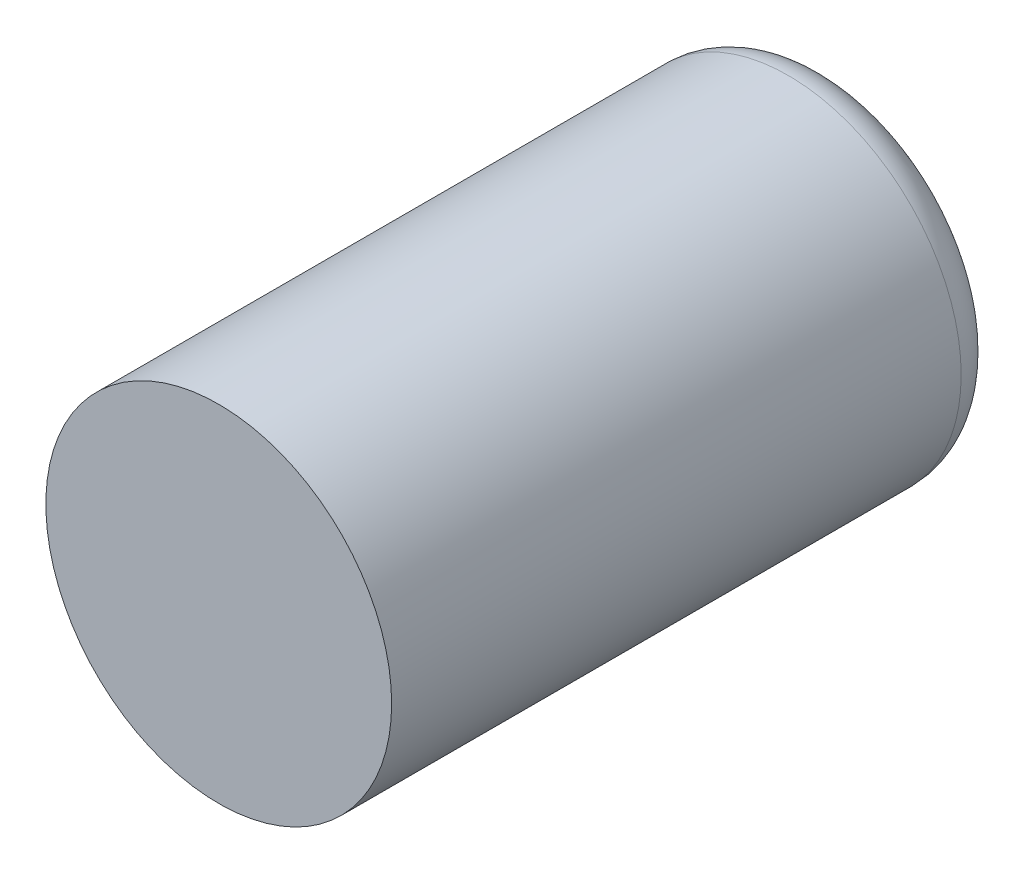
ISO-10303-21;
HEADER;
FILE_DESCRIPTION(('STEP AP214'),'2;1');
FILE_NAME('part.step','',(''),(''),'','','');
FILE_SCHEMA(('AUTOMOTIVE_DESIGN { 1 0 10303 214 1 1 1 1 }'));
ENDSEC;
DATA;
#1=APPLICATION_CONTEXT('core data for automotive mechanical design processes');
#2=APPLICATION_PROTOCOL_DEFINITION('international standard','automotive_design',2000,#1);
#3=PRODUCT_CONTEXT('',#1,'mechanical');
#4=PRODUCT('Part','Part','',(#3));
#5=PRODUCT_RELATED_PRODUCT_CATEGORY('part','',(#4));
#6=PRODUCT_DEFINITION_FORMATION('','',#4);
#7=PRODUCT_DEFINITION_CONTEXT('part definition',#1,'design');
#8=PRODUCT_DEFINITION('design','',#6,#7);
#9=PRODUCT_DEFINITION_SHAPE('','',#8);
#10=(LENGTH_UNIT() NAMED_UNIT(*) SI_UNIT(.MILLI.,.METRE.));
#11=(NAMED_UNIT(*) PLANE_ANGLE_UNIT() SI_UNIT($,.RADIAN.));
#12=(NAMED_UNIT(*) SI_UNIT($,.STERADIAN.) SOLID_ANGLE_UNIT());
#13=UNCERTAINTY_MEASURE_WITH_UNIT(LENGTH_MEASURE(1.E-05),#10,'distance_accuracy_value','');
#14=(GEOMETRIC_REPRESENTATION_CONTEXT(3) GLOBAL_UNCERTAINTY_ASSIGNED_CONTEXT((#13)) GLOBAL_UNIT_ASSIGNED_CONTEXT((#10,
#11,#12)) REPRESENTATION_CONTEXT('',''));
#15=CARTESIAN_POINT('',(0.,0.,0.));
#16=DIRECTION('',(0.,0.,1.));
#17=DIRECTION('',(1.,0.,0.));
#18=AXIS2_PLACEMENT_3D('',#15,#16,#17);
#19=CARTESIAN_POINT('',(0.,0.,2.));
#20=DIRECTION('',(0.,0.,1.));
#21=DIRECTION('',(1.,0.,0.));
#22=AXIS2_PLACEMENT_3D('',#19,#20,#21);
#23=TOROIDAL_SURFACE('',#22,6.5,2.);
#24=CARTESIAN_POINT('',(0.,0.,0.));
#25=DIRECTION('',(0.,0.,1.));
#26=DIRECTION('',(1.,0.,0.));
#27=AXIS2_PLACEMENT_3D('',#24,#25,#26);
#28=CIRCLE('',#27,6.5);
#29=CARTESIAN_POINT('',(6.5,0.,0.));
#30=VERTEX_POINT('',#29);
#31=EDGE_CURVE('E10',#30,#30,#28,.T.);
#32=ORIENTED_EDGE('',*,*,#31,.T.);
#33=EDGE_LOOP('',(#32));
#34=FACE_BOUND('',#33,.T.);
#35=CARTESIAN_POINT('',(0.,0.,2.));
#36=DIRECTION('',(0.,0.,1.));
#37=DIRECTION('',(1.,0.,0.));
#38=AXIS2_PLACEMENT_3D('',#35,#36,#37);
#39=CIRCLE('',#38,8.5);
#40=CARTESIAN_POINT('',(8.5,0.,2.));
#41=VERTEX_POINT('',#40);
#42=EDGE_CURVE('E43',#41,#41,#39,.T.);
#43=ORIENTED_EDGE('',*,*,#42,.F.);
#44=EDGE_LOOP('',(#43));
#45=FACE_BOUND('',#44,.T.);
#46=ADVANCED_FACE('F33',(#34,#45),#23,.T.);
#47=CARTESIAN_POINT('',(6.5,0.,0.));
#48=DIRECTION('',(0.,0.,-1.));
#49=DIRECTION('',(-1.,0.,0.));
#50=AXIS2_PLACEMENT_3D('',#47,#48,#49);
#51=PLANE('',#50);
#52=ORIENTED_EDGE('',*,*,#31,.F.);
#53=EDGE_LOOP('',(#52));
#54=FACE_BOUND('',#53,.T.);
#55=ADVANCED_FACE('F54',(#54),#51,.T.);
#56=CARTESIAN_POINT('',(0.,0.,30.));
#57=DIRECTION('',(0.,0.,1.));
#58=DIRECTION('',(1.,0.,0.));
#59=AXIS2_PLACEMENT_3D('',#56,#57,#58);
#60=PLANE('',#59);
#61=CARTESIAN_POINT('',(0.,0.,30.));
#62=DIRECTION('',(0.,0.,1.));
#63=DIRECTION('',(1.,0.,0.));
#64=AXIS2_PLACEMENT_3D('',#61,#62,#63);
#65=CIRCLE('',#64,8.5);
#66=CARTESIAN_POINT('',(8.5,0.,30.));
#67=VERTEX_POINT('',#66);
#68=EDGE_CURVE('E39',#67,#67,#65,.T.);
#69=ORIENTED_EDGE('',*,*,#68,.T.);
#70=EDGE_LOOP('',(#69));
#71=FACE_BOUND('',#70,.T.);
#72=ADVANCED_FACE('F58',(#71),#60,.T.);
#73=CARTESIAN_POINT('',(0.,0.,-0.00125399362039886));
#74=DIRECTION('',(0.,0.,1.));
#75=DIRECTION('',(1.,0.,0.));
#76=AXIS2_PLACEMENT_3D('',#73,#74,#75);
#77=CYLINDRICAL_SURFACE('',#76,8.5);
#78=ORIENTED_EDGE('',*,*,#42,.T.);
#79=EDGE_LOOP('',(#78));
#80=FACE_BOUND('',#79,.T.);
#81=ORIENTED_EDGE('',*,*,#68,.F.);
#82=EDGE_LOOP('',(#81));
#83=FACE_BOUND('',#82,.T.);
#84=ADVANCED_FACE('F50',(#80,#83),#77,.T.);
#85=CLOSED_SHELL('',(#46,#55,#72,#84));
#86=MANIFOLD_SOLID_BREP('B2',#85);
#87=ADVANCED_BREP_SHAPE_REPRESENTATION('',(#18,#86),#14);
#88=SHAPE_DEFINITION_REPRESENTATION(#9,#87);
ENDSEC;
END-ISO-10303-21;
